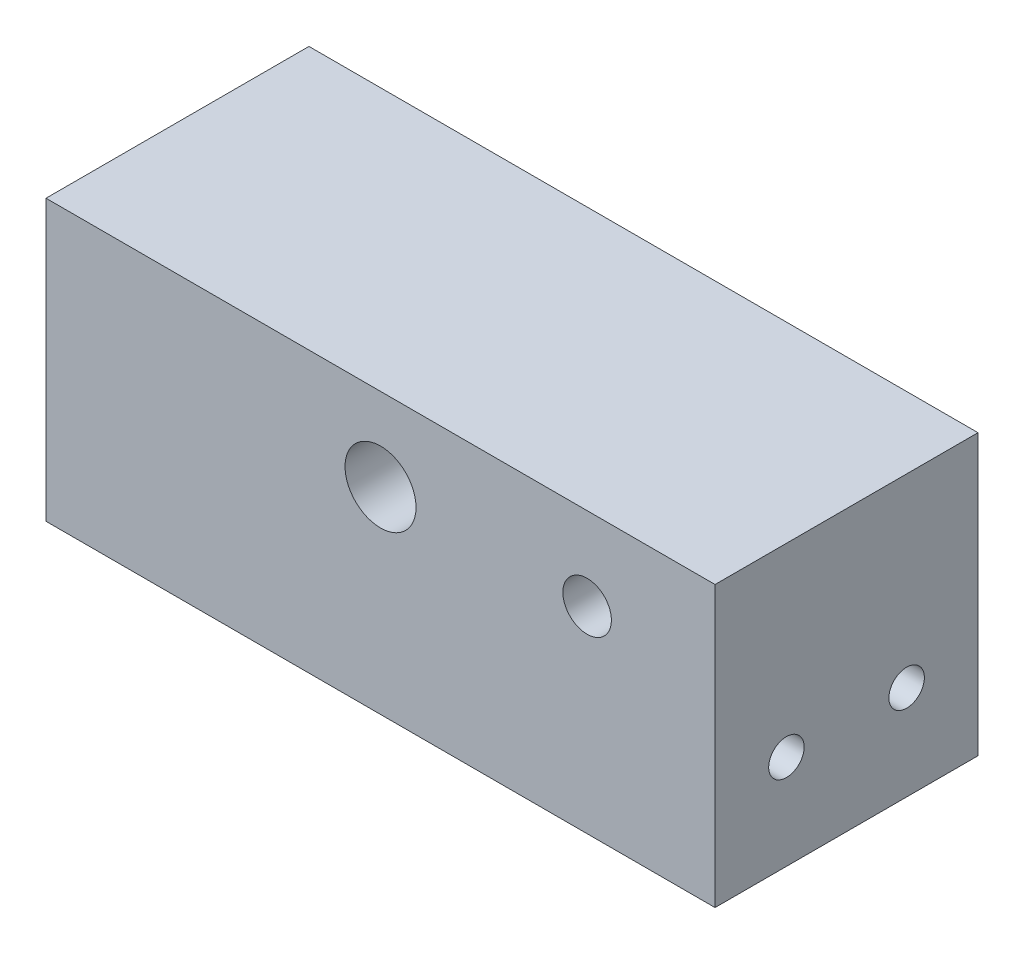
ISO-10303-21;
HEADER;
FILE_DESCRIPTION(('STEP AP214'),'2;1');
FILE_NAME('part.step','',(''),(''),'','','');
FILE_SCHEMA(('AUTOMOTIVE_DESIGN { 1 0 10303 214 1 1 1 1 }'));
ENDSEC;
DATA;
#1=APPLICATION_CONTEXT('core data for automotive mechanical design processes');
#2=APPLICATION_PROTOCOL_DEFINITION('international standard','automotive_design',2000,#1);
#3=PRODUCT_CONTEXT('',#1,'mechanical');
#4=PRODUCT('Part','Part','',(#3));
#5=PRODUCT_RELATED_PRODUCT_CATEGORY('part','',(#4));
#6=PRODUCT_DEFINITION_FORMATION('','',#4);
#7=PRODUCT_DEFINITION_CONTEXT('part definition',#1,'design');
#8=PRODUCT_DEFINITION('design','',#6,#7);
#9=PRODUCT_DEFINITION_SHAPE('','',#8);
#10=(LENGTH_UNIT() NAMED_UNIT(*) SI_UNIT(.MILLI.,.METRE.));
#11=(NAMED_UNIT(*) PLANE_ANGLE_UNIT() SI_UNIT($,.RADIAN.));
#12=(NAMED_UNIT(*) SI_UNIT($,.STERADIAN.) SOLID_ANGLE_UNIT());
#13=UNCERTAINTY_MEASURE_WITH_UNIT(LENGTH_MEASURE(1.E-05),#10,'distance_accuracy_value','');
#14=(GEOMETRIC_REPRESENTATION_CONTEXT(3) GLOBAL_UNCERTAINTY_ASSIGNED_CONTEXT((#13)) GLOBAL_UNIT_ASSIGNED_CONTEXT((#10,
#11,#12)) REPRESENTATION_CONTEXT('',''));
#15=CARTESIAN_POINT('',(0.,0.,0.));
#16=DIRECTION('',(0.,0.,1.));
#17=DIRECTION('',(1.,0.,0.));
#18=AXIS2_PLACEMENT_3D('',#15,#16,#17);
#19=CARTESIAN_POINT('',(-28.275,11.1125,22.225));
#20=DIRECTION('',(0.,1.,0.));
#21=DIRECTION('',(0.,0.,1.));
#22=AXIS2_PLACEMENT_3D('',#19,#20,#21);
#23=PLANE('',#22);
#24=DIRECTION('',(1.,0.,0.));
#25=VECTOR('',#24,1.);
#26=CARTESIAN_POINT('',(-28.275,11.1125,0.));
#27=LINE('',#26,#25);
#28=CARTESIAN_POINT('',(-28.275,11.1125,0.));
#29=VERTEX_POINT('',#28);
#30=CARTESIAN_POINT('',(28.275,11.1125,0.));
#31=VERTEX_POINT('',#30);
#32=EDGE_CURVE('E131',#29,#31,#27,.T.);
#33=ORIENTED_EDGE('',*,*,#32,.F.);
#34=DIRECTION('',(0.,0.,-1.));
#35=VECTOR('',#34,1.);
#36=CARTESIAN_POINT('',(-28.275,11.1125,22.225));
#37=LINE('',#36,#35);
#38=CARTESIAN_POINT('',(-28.275,11.1125,22.225));
#39=VERTEX_POINT('',#38);
#40=EDGE_CURVE('E11',#39,#29,#37,.T.);
#41=ORIENTED_EDGE('',*,*,#40,.F.);
#42=DIRECTION('',(1.,0.,0.));
#43=VECTOR('',#42,1.);
#44=CARTESIAN_POINT('',(-28.275,11.1125,22.225));
#45=LINE('',#44,#43);
#46=CARTESIAN_POINT('',(28.275,11.1125,22.225));
#47=VERTEX_POINT('',#46);
#48=EDGE_CURVE('E91',#39,#47,#45,.T.);
#49=ORIENTED_EDGE('',*,*,#48,.T.);
#50=DIRECTION('',(0.,0.,-1.));
#51=VECTOR('',#50,1.);
#52=CARTESIAN_POINT('',(28.275,11.1125,22.225));
#53=LINE('',#52,#51);
#54=EDGE_CURVE('E46',#47,#31,#53,.T.);
#55=ORIENTED_EDGE('',*,*,#54,.T.);
#56=EDGE_LOOP('',(#33,#41,#49,#55));
#57=FACE_BOUND('',#56,.T.);
#58=ADVANCED_FACE('F43',(#57),#23,.T.);
#59=CARTESIAN_POINT('',(-28.275,11.1125,22.225));
#60=DIRECTION('',(1.,0.,0.));
#61=DIRECTION('',(0.,1.,0.));
#62=AXIS2_PLACEMENT_3D('',#59,#60,#61);
#63=PLANE('',#62);
#64=CARTESIAN_POINT('',(-28.275,-4.53750010000002,16.1925));
#65=DIRECTION('',(-1.,0.,0.));
#66=DIRECTION('',(0.,-1.,0.));
#67=AXIS2_PLACEMENT_3D('',#64,#65,#66);
#68=CIRCLE('',#67,1.5);
#69=CARTESIAN_POINT('',(-28.275,-6.03750010000002,16.1925));
#70=VERTEX_POINT('',#69);
#71=EDGE_CURVE('E120',#70,#70,#68,.T.);
#72=ORIENTED_EDGE('',*,*,#71,.F.);
#73=EDGE_LOOP('',(#72));
#74=FACE_BOUND('',#73,.T.);
#75=CARTESIAN_POINT('',(-28.275,-4.53750010000002,6.0325));
#76=DIRECTION('',(-1.,0.,0.));
#77=DIRECTION('',(0.,-1.,0.));
#78=AXIS2_PLACEMENT_3D('',#75,#76,#77);
#79=CIRCLE('',#78,1.5);
#80=CARTESIAN_POINT('',(-28.275,-6.03750010000002,6.0325));
#81=VERTEX_POINT('',#80);
#82=EDGE_CURVE('E123',#81,#81,#79,.T.);
#83=ORIENTED_EDGE('',*,*,#82,.F.);
#84=EDGE_LOOP('',(#83));
#85=FACE_BOUND('',#84,.T.);
#86=DIRECTION('',(0.,-1.,0.));
#87=VECTOR('',#86,1.);
#88=CARTESIAN_POINT('',(-28.275,11.1125,0.));
#89=LINE('',#88,#87);
#90=CARTESIAN_POINT('',(-28.275,-12.53744,0.));
#91=VERTEX_POINT('',#90);
#92=EDGE_CURVE('E84',#29,#91,#89,.T.);
#93=ORIENTED_EDGE('',*,*,#92,.T.);
#94=DIRECTION('',(0.,0.,-1.));
#95=VECTOR('',#94,1.);
#96=CARTESIAN_POINT('',(-28.275,-12.53744,22.225));
#97=LINE('',#96,#95);
#98=CARTESIAN_POINT('',(-28.275,-12.53744,22.225));
#99=VERTEX_POINT('',#98);
#100=EDGE_CURVE('E88',#99,#91,#97,.T.);
#101=ORIENTED_EDGE('',*,*,#100,.F.);
#102=DIRECTION('',(0.,-1.,0.));
#103=VECTOR('',#102,1.);
#104=CARTESIAN_POINT('',(-28.275,11.1125,22.225));
#105=LINE('',#104,#103);
#106=EDGE_CURVE('E71',#39,#99,#105,.T.);
#107=ORIENTED_EDGE('',*,*,#106,.F.);
#108=ORIENTED_EDGE('',*,*,#40,.T.);
#109=EDGE_LOOP('',(#93,#101,#107,#108));
#110=FACE_BOUND('',#109,.T.);
#111=ADVANCED_FACE('F86',(#74,#85,#110),#63,.F.);
#112=CARTESIAN_POINT('',(28.275,11.1125,22.225));
#113=DIRECTION('',(1.,0.,0.));
#114=DIRECTION('',(0.,1.,0.));
#115=AXIS2_PLACEMENT_3D('',#112,#113,#114);
#116=PLANE('',#115);
#117=CARTESIAN_POINT('',(28.275,-4.53750010000002,16.1925));
#118=DIRECTION('',(-1.,0.,0.));
#119=DIRECTION('',(0.,-1.,0.));
#120=AXIS2_PLACEMENT_3D('',#117,#118,#119);
#121=CIRCLE('',#120,1.5);
#122=CARTESIAN_POINT('',(28.275,-6.03750010000002,16.1925));
#123=VERTEX_POINT('',#122);
#124=EDGE_CURVE('E107',#123,#123,#121,.T.);
#125=ORIENTED_EDGE('',*,*,#124,.T.);
#126=EDGE_LOOP('',(#125));
#127=FACE_BOUND('',#126,.T.);
#128=CARTESIAN_POINT('',(28.275,-4.53750010000002,6.0325));
#129=DIRECTION('',(-1.,0.,0.));
#130=DIRECTION('',(0.,-1.,0.));
#131=AXIS2_PLACEMENT_3D('',#128,#129,#130);
#132=CIRCLE('',#131,1.5);
#133=CARTESIAN_POINT('',(28.275,-6.03750010000002,6.0325));
#134=VERTEX_POINT('',#133);
#135=EDGE_CURVE('E110',#134,#134,#132,.T.);
#136=ORIENTED_EDGE('',*,*,#135,.T.);
#137=EDGE_LOOP('',(#136));
#138=FACE_BOUND('',#137,.T.);
#139=DIRECTION('',(0.,-1.,0.));
#140=VECTOR('',#139,1.);
#141=CARTESIAN_POINT('',(28.275,11.1125,0.));
#142=LINE('',#141,#140);
#143=CARTESIAN_POINT('',(28.275,-12.53744,0.));
#144=VERTEX_POINT('',#143);
#145=EDGE_CURVE('E92',#31,#144,#142,.T.);
#146=ORIENTED_EDGE('',*,*,#145,.F.);
#147=ORIENTED_EDGE('',*,*,#54,.F.);
#148=DIRECTION('',(0.,-1.,0.));
#149=VECTOR('',#148,1.);
#150=CARTESIAN_POINT('',(28.275,11.1125,22.225));
#151=LINE('',#150,#149);
#152=CARTESIAN_POINT('',(28.275,-12.53744,22.225));
#153=VERTEX_POINT('',#152);
#154=EDGE_CURVE('E141',#47,#153,#151,.T.);
#155=ORIENTED_EDGE('',*,*,#154,.T.);
#156=DIRECTION('',(0.,0.,1.));
#157=VECTOR('',#156,1.);
#158=CARTESIAN_POINT('',(28.275,-12.53744,0.));
#159=LINE('',#158,#157);
#160=EDGE_CURVE('E100',#144,#153,#159,.T.);
#161=ORIENTED_EDGE('',*,*,#160,.F.);
#162=EDGE_LOOP('',(#146,#147,#155,#161));
#163=FACE_BOUND('',#162,.T.);
#164=ADVANCED_FACE('F150',(#127,#138,#163),#116,.T.);
#165=CARTESIAN_POINT('',(0.,0.,22.225));
#166=DIRECTION('',(0.,0.,-1.));
#167=DIRECTION('',(-1.,0.,0.));
#168=AXIS2_PLACEMENT_3D('',#165,#166,#167);
#169=PLANE('',#168);
#170=CARTESIAN_POINT('',(17.4625,4.1125,22.225));
#171=DIRECTION('',(0.,0.,1.));
#172=DIRECTION('',(1.,0.,0.));
#173=AXIS2_PLACEMENT_3D('',#170,#171,#172);
#174=CIRCLE('',#173,2.05);
#175=CARTESIAN_POINT('',(19.5125,4.1125,22.225));
#176=VERTEX_POINT('',#175);
#177=EDGE_CURVE('E132',#176,#176,#174,.T.);
#178=ORIENTED_EDGE('',*,*,#177,.F.);
#179=EDGE_LOOP('',(#178));
#180=FACE_BOUND('',#179,.T.);
#181=CARTESIAN_POINT('',(0.,4.1125,22.225));
#182=DIRECTION('',(0.,0.,1.));
#183=DIRECTION('',(1.,0.,0.));
#184=AXIS2_PLACEMENT_3D('',#181,#182,#183);
#185=CIRCLE('',#184,3.);
#186=CARTESIAN_POINT('',(3.,4.1125,22.225));
#187=VERTEX_POINT('',#186);
#188=EDGE_CURVE('E119',#187,#187,#185,.T.);
#189=ORIENTED_EDGE('',*,*,#188,.F.);
#190=EDGE_LOOP('',(#189));
#191=FACE_BOUND('',#190,.T.);
#192=ORIENTED_EDGE('',*,*,#48,.F.);
#193=ORIENTED_EDGE('',*,*,#106,.T.);
#194=DIRECTION('',(-1.,0.,0.));
#195=VECTOR('',#194,1.);
#196=CARTESIAN_POINT('',(28.275,-12.53744,22.225));
#197=LINE('',#196,#195);
#198=EDGE_CURVE('E103',#153,#99,#197,.T.);
#199=ORIENTED_EDGE('',*,*,#198,.F.);
#200=ORIENTED_EDGE('',*,*,#154,.F.);
#201=EDGE_LOOP('',(#192,#193,#199,#200));
#202=FACE_BOUND('',#201,.T.);
#203=ADVANCED_FACE('F158',(#180,#191,#202),#169,.F.);
#204=CARTESIAN_POINT('',(0.,0.,0.));
#205=DIRECTION('',(0.,0.,-1.));
#206=DIRECTION('',(-1.,0.,0.));
#207=AXIS2_PLACEMENT_3D('',#204,#205,#206);
#208=PLANE('',#207);
#209=CARTESIAN_POINT('',(10.,1.1125,0.));
#210=DIRECTION('',(0.,0.,-1.));
#211=DIRECTION('',(-1.,0.,0.));
#212=AXIS2_PLACEMENT_3D('',#209,#210,#211);
#213=CIRCLE('',#212,3.025);
#214=CARTESIAN_POINT('',(6.975,1.1125,0.));
#215=VERTEX_POINT('',#214);
#216=EDGE_CURVE('E236',#215,#215,#213,.T.);
#217=ORIENTED_EDGE('',*,*,#216,.F.);
#218=EDGE_LOOP('',(#217));
#219=FACE_BOUND('',#218,.T.);
#220=CARTESIAN_POINT('',(-10.,1.1125,0.));
#221=DIRECTION('',(0.,0.,-1.));
#222=DIRECTION('',(-1.,0.,0.));
#223=AXIS2_PLACEMENT_3D('',#220,#221,#222);
#224=CIRCLE('',#223,3.025);
#225=CARTESIAN_POINT('',(-13.025,1.1125,0.));
#226=VERTEX_POINT('',#225);
#227=EDGE_CURVE('E241',#226,#226,#224,.T.);
#228=ORIENTED_EDGE('',*,*,#227,.F.);
#229=EDGE_LOOP('',(#228));
#230=FACE_BOUND('',#229,.T.);
#231=ORIENTED_EDGE('',*,*,#32,.T.);
#232=ORIENTED_EDGE('',*,*,#145,.T.);
#233=DIRECTION('',(1.,0.,0.));
#234=VECTOR('',#233,1.);
#235=CARTESIAN_POINT('',(-28.275,-12.53744,0.));
#236=LINE('',#235,#234);
#237=EDGE_CURVE('E95',#91,#144,#236,.T.);
#238=ORIENTED_EDGE('',*,*,#237,.F.);
#239=ORIENTED_EDGE('',*,*,#92,.F.);
#240=EDGE_LOOP('',(#231,#232,#238,#239));
#241=FACE_BOUND('',#240,.T.);
#242=ADVANCED_FACE('F96',(#219,#230,#241),#208,.T.);
#243=CARTESIAN_POINT('',(0.,4.1125,12.225));
#244=DIRECTION('',(0.,0.,1.));
#245=DIRECTION('',(1.,0.,0.));
#246=AXIS2_PLACEMENT_3D('',#243,#244,#245);
#247=CYLINDRICAL_SURFACE('',#246,3.);
#248=CARTESIAN_POINT('',(0.,4.1125,12.225));
#249=DIRECTION('',(0.,0.,1.));
#250=DIRECTION('',(1.,0.,0.));
#251=AXIS2_PLACEMENT_3D('',#248,#249,#250);
#252=CIRCLE('',#251,3.);
#253=CARTESIAN_POINT('',(3.,4.1125,12.225));
#254=VERTEX_POINT('',#253);
#255=EDGE_CURVE('E135',#254,#254,#252,.T.);
#256=ORIENTED_EDGE('',*,*,#255,.F.);
#257=EDGE_LOOP('',(#256));
#258=FACE_BOUND('',#257,.T.);
#259=ORIENTED_EDGE('',*,*,#188,.T.);
#260=EDGE_LOOP('',(#259));
#261=FACE_BOUND('',#260,.T.);
#262=ADVANCED_FACE('F165',(#258,#261),#247,.F.);
#263=CARTESIAN_POINT('',(0.,0.,12.225));
#264=DIRECTION('',(0.,0.,1.));
#265=DIRECTION('',(1.,0.,0.));
#266=AXIS2_PLACEMENT_3D('',#263,#264,#265);
#267=PLANE('',#266);
#268=ORIENTED_EDGE('',*,*,#255,.T.);
#269=EDGE_LOOP('',(#268));
#270=FACE_BOUND('',#269,.T.);
#271=ADVANCED_FACE('F170',(#270),#267,.T.);
#272=CARTESIAN_POINT('',(17.4625,4.1125,12.225));
#273=DIRECTION('',(0.,0.,1.));
#274=DIRECTION('',(1.,0.,0.));
#275=AXIS2_PLACEMENT_3D('',#272,#273,#274);
#276=CYLINDRICAL_SURFACE('',#275,2.05);
#277=CARTESIAN_POINT('',(17.4625,4.1125,12.225));
#278=DIRECTION('',(0.,0.,1.));
#279=DIRECTION('',(1.,0.,0.));
#280=AXIS2_PLACEMENT_3D('',#277,#278,#279);
#281=CIRCLE('',#280,2.05);
#282=CARTESIAN_POINT('',(19.5125,4.1125,12.225));
#283=VERTEX_POINT('',#282);
#284=EDGE_CURVE('E128',#283,#283,#281,.T.);
#285=ORIENTED_EDGE('',*,*,#284,.F.);
#286=EDGE_LOOP('',(#285));
#287=FACE_BOUND('',#286,.T.);
#288=ORIENTED_EDGE('',*,*,#177,.T.);
#289=EDGE_LOOP('',(#288));
#290=FACE_BOUND('',#289,.T.);
#291=ADVANCED_FACE('F174',(#287,#290),#276,.F.);
#292=CARTESIAN_POINT('',(0.,0.,12.225));
#293=DIRECTION('',(0.,0.,1.));
#294=DIRECTION('',(1.,0.,0.));
#295=AXIS2_PLACEMENT_3D('',#292,#293,#294);
#296=PLANE('',#295);
#297=ORIENTED_EDGE('',*,*,#284,.T.);
#298=EDGE_LOOP('',(#297));
#299=FACE_BOUND('',#298,.T.);
#300=ADVANCED_FACE('F178',(#299),#296,.T.);
#301=CARTESIAN_POINT('',(-20.275,-4.53750010000002,6.0325));
#302=DIRECTION('',(-1.,0.,0.));
#303=DIRECTION('',(0.,-1.,0.));
#304=AXIS2_PLACEMENT_3D('',#301,#302,#303);
#305=CYLINDRICAL_SURFACE('',#304,1.5);
#306=CARTESIAN_POINT('',(-20.275,-4.53750010000002,6.0325));
#307=DIRECTION('',(-1.,0.,0.));
#308=DIRECTION('',(0.,-1.,0.));
#309=AXIS2_PLACEMENT_3D('',#306,#307,#308);
#310=CIRCLE('',#309,1.5);
#311=CARTESIAN_POINT('',(-20.275,-6.03750010000002,6.0325));
#312=VERTEX_POINT('',#311);
#313=EDGE_CURVE('E115',#312,#312,#310,.T.);
#314=ORIENTED_EDGE('',*,*,#313,.F.);
#315=EDGE_LOOP('',(#314));
#316=FACE_BOUND('',#315,.T.);
#317=ORIENTED_EDGE('',*,*,#82,.T.);
#318=EDGE_LOOP('',(#317));
#319=FACE_BOUND('',#318,.T.);
#320=ADVANCED_FACE('F182',(#316,#319),#305,.F.);
#321=CARTESIAN_POINT('',(-20.275,-4.53750010000002,6.0325));
#322=DIRECTION('',(-1.,0.,0.));
#323=DIRECTION('',(0.,-1.,0.));
#324=AXIS2_PLACEMENT_3D('',#321,#322,#323);
#325=PLANE('',#324);
#326=ORIENTED_EDGE('',*,*,#313,.T.);
#327=EDGE_LOOP('',(#326));
#328=FACE_BOUND('',#327,.T.);
#329=ADVANCED_FACE('F184',(#328),#325,.T.);
#330=CARTESIAN_POINT('',(-20.275,-4.53750010000002,16.1925));
#331=DIRECTION('',(-1.,0.,0.));
#332=DIRECTION('',(0.,-1.,0.));
#333=AXIS2_PLACEMENT_3D('',#330,#331,#332);
#334=CYLINDRICAL_SURFACE('',#333,1.5);
#335=CARTESIAN_POINT('',(-20.275,-4.53750010000002,16.1925));
#336=DIRECTION('',(-1.,0.,0.));
#337=DIRECTION('',(0.,-1.,0.));
#338=AXIS2_PLACEMENT_3D('',#335,#336,#337);
#339=CIRCLE('',#338,1.5);
#340=CARTESIAN_POINT('',(-20.275,-6.03750010000002,16.1925));
#341=VERTEX_POINT('',#340);
#342=EDGE_CURVE('E116',#341,#341,#339,.T.);
#343=ORIENTED_EDGE('',*,*,#342,.F.);
#344=EDGE_LOOP('',(#343));
#345=FACE_BOUND('',#344,.T.);
#346=ORIENTED_EDGE('',*,*,#71,.T.);
#347=EDGE_LOOP('',(#346));
#348=FACE_BOUND('',#347,.T.);
#349=ADVANCED_FACE('F187',(#345,#348),#334,.F.);
#350=CARTESIAN_POINT('',(-20.275,-4.53750010000002,16.1925));
#351=DIRECTION('',(-1.,0.,0.));
#352=DIRECTION('',(0.,-1.,0.));
#353=AXIS2_PLACEMENT_3D('',#350,#351,#352);
#354=PLANE('',#353);
#355=ORIENTED_EDGE('',*,*,#342,.T.);
#356=EDGE_LOOP('',(#355));
#357=FACE_BOUND('',#356,.T.);
#358=ADVANCED_FACE('F194',(#357),#354,.T.);
#359=CARTESIAN_POINT('',(0.,-12.53744,0.));
#360=DIRECTION('',(0.,-1.,0.));
#361=DIRECTION('',(0.,0.,-1.));
#362=AXIS2_PLACEMENT_3D('',#359,#360,#361);
#363=PLANE('',#362);
#364=ORIENTED_EDGE('',*,*,#100,.T.);
#365=ORIENTED_EDGE('',*,*,#237,.T.);
#366=ORIENTED_EDGE('',*,*,#160,.T.);
#367=ORIENTED_EDGE('',*,*,#198,.T.);
#368=EDGE_LOOP('',(#364,#365,#366,#367));
#369=FACE_BOUND('',#368,.T.);
#370=ADVANCED_FACE('F102',(#369),#363,.T.);
#371=CARTESIAN_POINT('',(20.275,-4.53750010000002,6.0325));
#372=DIRECTION('',(1.,0.,0.));
#373=DIRECTION('',(0.,1.,0.));
#374=AXIS2_PLACEMENT_3D('',#371,#372,#373);
#375=CYLINDRICAL_SURFACE('',#374,1.5);
#376=CARTESIAN_POINT('',(20.275,-4.53750010000002,6.0325));
#377=DIRECTION('',(-1.,0.,0.));
#378=DIRECTION('',(0.,-1.,0.));
#379=AXIS2_PLACEMENT_3D('',#376,#377,#378);
#380=CIRCLE('',#379,1.5);
#381=CARTESIAN_POINT('',(20.275,-6.03750010000002,6.0325));
#382=VERTEX_POINT('',#381);
#383=EDGE_CURVE('E239',#382,#382,#380,.T.);
#384=ORIENTED_EDGE('',*,*,#383,.T.);
#385=EDGE_LOOP('',(#384));
#386=FACE_BOUND('',#385,.T.);
#387=ORIENTED_EDGE('',*,*,#135,.F.);
#388=EDGE_LOOP('',(#387));
#389=FACE_BOUND('',#388,.T.);
#390=ADVANCED_FACE('F200',(#386,#389),#375,.F.);
#391=CARTESIAN_POINT('',(20.275,-4.53750010000002,6.0325));
#392=DIRECTION('',(1.,0.,0.));
#393=DIRECTION('',(0.,-1.,0.));
#394=AXIS2_PLACEMENT_3D('',#391,#392,#393);
#395=PLANE('',#394);
#396=ORIENTED_EDGE('',*,*,#383,.F.);
#397=EDGE_LOOP('',(#396));
#398=FACE_BOUND('',#397,.T.);
#399=ADVANCED_FACE('F203',(#398),#395,.T.);
#400=CARTESIAN_POINT('',(20.275,-4.53750010000002,16.1925));
#401=DIRECTION('',(1.,0.,0.));
#402=DIRECTION('',(0.,1.,0.));
#403=AXIS2_PLACEMENT_3D('',#400,#401,#402);
#404=CYLINDRICAL_SURFACE('',#403,1.5);
#405=CARTESIAN_POINT('',(20.275,-4.53750010000002,16.1925));
#406=DIRECTION('',(-1.,0.,0.));
#407=DIRECTION('',(0.,-1.,0.));
#408=AXIS2_PLACEMENT_3D('',#405,#406,#407);
#409=CIRCLE('',#408,1.5);
#410=CARTESIAN_POINT('',(20.275,-6.03750010000002,16.1925));
#411=VERTEX_POINT('',#410);
#412=EDGE_CURVE('E104',#411,#411,#409,.T.);
#413=ORIENTED_EDGE('',*,*,#412,.T.);
#414=EDGE_LOOP('',(#413));
#415=FACE_BOUND('',#414,.T.);
#416=ORIENTED_EDGE('',*,*,#124,.F.);
#417=EDGE_LOOP('',(#416));
#418=FACE_BOUND('',#417,.T.);
#419=ADVANCED_FACE('F207',(#415,#418),#404,.F.);
#420=CARTESIAN_POINT('',(20.275,-4.53750010000002,16.1925));
#421=DIRECTION('',(1.,0.,0.));
#422=DIRECTION('',(0.,-1.,0.));
#423=AXIS2_PLACEMENT_3D('',#420,#421,#422);
#424=PLANE('',#423);
#425=ORIENTED_EDGE('',*,*,#412,.F.);
#426=EDGE_LOOP('',(#425));
#427=FACE_BOUND('',#426,.T.);
#428=ADVANCED_FACE('F211',(#427),#424,.T.);
#429=CARTESIAN_POINT('',(-10.,1.1125,10.));
#430=DIRECTION('',(0.,0.,-1.));
#431=DIRECTION('',(-1.,0.,0.));
#432=AXIS2_PLACEMENT_3D('',#429,#430,#431);
#433=CYLINDRICAL_SURFACE('',#432,3.025);
#434=CARTESIAN_POINT('',(-10.,1.1125,10.));
#435=DIRECTION('',(0.,0.,-1.));
#436=DIRECTION('',(-1.,0.,0.));
#437=AXIS2_PLACEMENT_3D('',#434,#435,#436);
#438=CIRCLE('',#437,3.025);
#439=CARTESIAN_POINT('',(-13.025,1.1125,10.));
#440=VERTEX_POINT('',#439);
#441=EDGE_CURVE('E246',#440,#440,#438,.T.);
#442=ORIENTED_EDGE('',*,*,#441,.F.);
#443=EDGE_LOOP('',(#442));
#444=FACE_BOUND('',#443,.T.);
#445=ORIENTED_EDGE('',*,*,#227,.T.);
#446=EDGE_LOOP('',(#445));
#447=FACE_BOUND('',#446,.T.);
#448=ADVANCED_FACE('F215',(#444,#447),#433,.F.);
#449=CARTESIAN_POINT('',(-10.,1.1125,10.));
#450=DIRECTION('',(0.,0.,-1.));
#451=DIRECTION('',(-1.,0.,0.));
#452=AXIS2_PLACEMENT_3D('',#449,#450,#451);
#453=PLANE('',#452);
#454=ORIENTED_EDGE('',*,*,#441,.T.);
#455=EDGE_LOOP('',(#454));
#456=FACE_BOUND('',#455,.T.);
#457=ADVANCED_FACE('F217',(#456),#453,.T.);
#458=CARTESIAN_POINT('',(10.,1.1125,10.));
#459=DIRECTION('',(0.,0.,-1.));
#460=DIRECTION('',(-1.,0.,0.));
#461=AXIS2_PLACEMENT_3D('',#458,#459,#460);
#462=CYLINDRICAL_SURFACE('',#461,3.025);
#463=CARTESIAN_POINT('',(10.,1.1125,10.));
#464=DIRECTION('',(0.,0.,-1.));
#465=DIRECTION('',(-1.,0.,0.));
#466=AXIS2_PLACEMENT_3D('',#463,#464,#465);
#467=CIRCLE('',#466,3.025);
#468=CARTESIAN_POINT('',(6.975,1.1125,10.));
#469=VERTEX_POINT('',#468);
#470=EDGE_CURVE('E235',#469,#469,#467,.T.);
#471=ORIENTED_EDGE('',*,*,#470,.F.);
#472=EDGE_LOOP('',(#471));
#473=FACE_BOUND('',#472,.T.);
#474=ORIENTED_EDGE('',*,*,#216,.T.);
#475=EDGE_LOOP('',(#474));
#476=FACE_BOUND('',#475,.T.);
#477=ADVANCED_FACE('F220',(#473,#476),#462,.F.);
#478=CARTESIAN_POINT('',(10.,1.1125,10.));
#479=DIRECTION('',(0.,0.,-1.));
#480=DIRECTION('',(-1.,0.,0.));
#481=AXIS2_PLACEMENT_3D('',#478,#479,#480);
#482=PLANE('',#481);
#483=ORIENTED_EDGE('',*,*,#470,.T.);
#484=EDGE_LOOP('',(#483));
#485=FACE_BOUND('',#484,.T.);
#486=ADVANCED_FACE('F227',(#485),#482,.T.);
#487=CLOSED_SHELL('',(#58,#111,#164,#203,#242,#262,#271,#291,#300,#320,#329,#349,#358,#370,#390,
#399,#419,#428,#448,#457,#477,#486));
#488=MANIFOLD_SOLID_BREP('B2',#487);
#489=ADVANCED_BREP_SHAPE_REPRESENTATION('',(#18,#488),#14);
#490=SHAPE_DEFINITION_REPRESENTATION(#9,#489);
ENDSEC;
END-ISO-10303-21;
